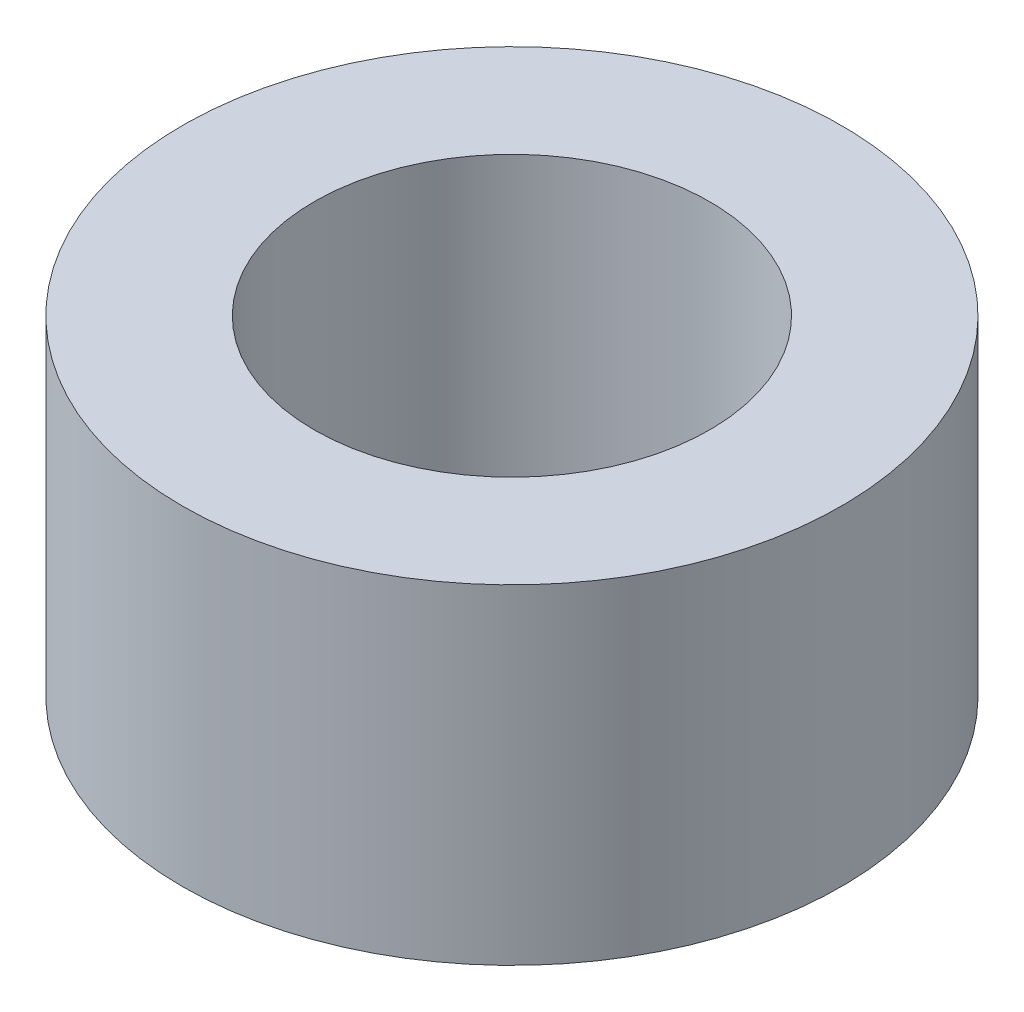
ISO-10303-21;
HEADER;
FILE_DESCRIPTION(('STEP AP214'),'2;1');
FILE_NAME('part.step','',(''),(''),'','','');
FILE_SCHEMA(('AUTOMOTIVE_DESIGN { 1 0 10303 214 1 1 1 1 }'));
ENDSEC;
DATA;
#1=APPLICATION_CONTEXT('core data for automotive mechanical design processes');
#2=APPLICATION_PROTOCOL_DEFINITION('international standard','automotive_design',2000,#1);
#3=PRODUCT_CONTEXT('',#1,'mechanical');
#4=PRODUCT('Part','Part','',(#3));
#5=PRODUCT_RELATED_PRODUCT_CATEGORY('part','',(#4));
#6=PRODUCT_DEFINITION_FORMATION('','',#4);
#7=PRODUCT_DEFINITION_CONTEXT('part definition',#1,'design');
#8=PRODUCT_DEFINITION('design','',#6,#7);
#9=PRODUCT_DEFINITION_SHAPE('','',#8);
#10=(LENGTH_UNIT() NAMED_UNIT(*) SI_UNIT(.MILLI.,.METRE.));
#11=(NAMED_UNIT(*) PLANE_ANGLE_UNIT() SI_UNIT($,.RADIAN.));
#12=(NAMED_UNIT(*) SI_UNIT($,.STERADIAN.) SOLID_ANGLE_UNIT());
#13=UNCERTAINTY_MEASURE_WITH_UNIT(LENGTH_MEASURE(1.E-05),#10,'distance_accuracy_value','');
#14=(GEOMETRIC_REPRESENTATION_CONTEXT(3) GLOBAL_UNCERTAINTY_ASSIGNED_CONTEXT((#13)) GLOBAL_UNIT_ASSIGNED_CONTEXT((#10,
#11,#12)) REPRESENTATION_CONTEXT('',''));
#15=CARTESIAN_POINT('',(0.,0.,0.));
#16=DIRECTION('',(0.,0.,1.));
#17=DIRECTION('',(1.,0.,0.));
#18=AXIS2_PLACEMENT_3D('',#15,#16,#17);
#19=CARTESIAN_POINT('',(0.,5.,0.));
#20=DIRECTION('',(0.,1.,0.));
#21=DIRECTION('',(0.,0.,1.));
#22=AXIS2_PLACEMENT_3D('',#19,#20,#21);
#23=PLANE('',#22);
#24=CARTESIAN_POINT('',(0.,5.,0.));
#25=DIRECTION('',(0.,1.,0.));
#26=DIRECTION('',(0.,0.,1.));
#27=AXIS2_PLACEMENT_3D('',#24,#25,#26);
#28=CIRCLE('',#27,5.);
#29=CARTESIAN_POINT('',(0.,5.,5.));
#30=VERTEX_POINT('',#29);
#31=EDGE_CURVE('E10',#30,#30,#28,.T.);
#32=ORIENTED_EDGE('',*,*,#31,.T.);
#33=EDGE_LOOP('',(#32));
#34=FACE_BOUND('',#33,.T.);
#35=CARTESIAN_POINT('',(0.,5.,0.));
#36=DIRECTION('',(0.,1.,0.));
#37=DIRECTION('',(0.,0.,1.));
#38=AXIS2_PLACEMENT_3D('',#35,#36,#37);
#39=CIRCLE('',#38,3.);
#40=CARTESIAN_POINT('',(0.,5.,3.));
#41=VERTEX_POINT('',#40);
#42=EDGE_CURVE('E42',#41,#41,#39,.T.);
#43=ORIENTED_EDGE('',*,*,#42,.F.);
#44=EDGE_LOOP('',(#43));
#45=FACE_BOUND('',#44,.T.);
#46=ADVANCED_FACE('F31',(#34,#45),#23,.T.);
#47=CARTESIAN_POINT('',(0.,0.,0.));
#48=DIRECTION('',(0.,1.,0.));
#49=DIRECTION('',(0.,0.,1.));
#50=AXIS2_PLACEMENT_3D('',#47,#48,#49);
#51=PLANE('',#50);
#52=CARTESIAN_POINT('',(0.,0.,0.));
#53=DIRECTION('',(0.,1.,0.));
#54=DIRECTION('',(0.,0.,1.));
#55=AXIS2_PLACEMENT_3D('',#52,#53,#54);
#56=CIRCLE('',#55,5.);
#57=CARTESIAN_POINT('',(0.,0.,5.));
#58=VERTEX_POINT('',#57);
#59=EDGE_CURVE('E35',#58,#58,#56,.T.);
#60=ORIENTED_EDGE('',*,*,#59,.F.);
#61=EDGE_LOOP('',(#60));
#62=FACE_BOUND('',#61,.T.);
#63=CARTESIAN_POINT('',(0.,0.,0.));
#64=DIRECTION('',(0.,1.,0.));
#65=DIRECTION('',(0.,0.,1.));
#66=AXIS2_PLACEMENT_3D('',#63,#64,#65);
#67=CIRCLE('',#66,3.);
#68=CARTESIAN_POINT('',(0.,0.,3.));
#69=VERTEX_POINT('',#68);
#70=EDGE_CURVE('E44',#69,#69,#67,.T.);
#71=ORIENTED_EDGE('',*,*,#70,.T.);
#72=EDGE_LOOP('',(#71));
#73=FACE_BOUND('',#72,.T.);
#74=ADVANCED_FACE('F54',(#62,#73),#51,.F.);
#75=CARTESIAN_POINT('',(0.,5.,0.));
#76=DIRECTION('',(0.,-1.,0.));
#77=DIRECTION('',(0.,0.,-1.));
#78=AXIS2_PLACEMENT_3D('',#75,#76,#77);
#79=CYLINDRICAL_SURFACE('',#78,5.);
#80=ORIENTED_EDGE('',*,*,#31,.F.);
#81=EDGE_LOOP('',(#80));
#82=FACE_BOUND('',#81,.T.);
#83=ORIENTED_EDGE('',*,*,#59,.T.);
#84=EDGE_LOOP('',(#83));
#85=FACE_BOUND('',#84,.T.);
#86=ADVANCED_FACE('F33',(#82,#85),#79,.T.);
#87=CARTESIAN_POINT('',(0.,5.,0.));
#88=DIRECTION('',(0.,-1.,0.));
#89=DIRECTION('',(0.,0.,-1.));
#90=AXIS2_PLACEMENT_3D('',#87,#88,#89);
#91=CYLINDRICAL_SURFACE('',#90,3.);
#92=ORIENTED_EDGE('',*,*,#42,.T.);
#93=EDGE_LOOP('',(#92));
#94=FACE_BOUND('',#93,.T.);
#95=ORIENTED_EDGE('',*,*,#70,.F.);
#96=EDGE_LOOP('',(#95));
#97=FACE_BOUND('',#96,.T.);
#98=ADVANCED_FACE('F50',(#94,#97),#91,.F.);
#99=CLOSED_SHELL('',(#46,#74,#86,#98));
#100=MANIFOLD_SOLID_BREP('B2',#99);
#101=ADVANCED_BREP_SHAPE_REPRESENTATION('',(#18,#100),#14);
#102=SHAPE_DEFINITION_REPRESENTATION(#9,#101);
ENDSEC;
END-ISO-10303-21;
